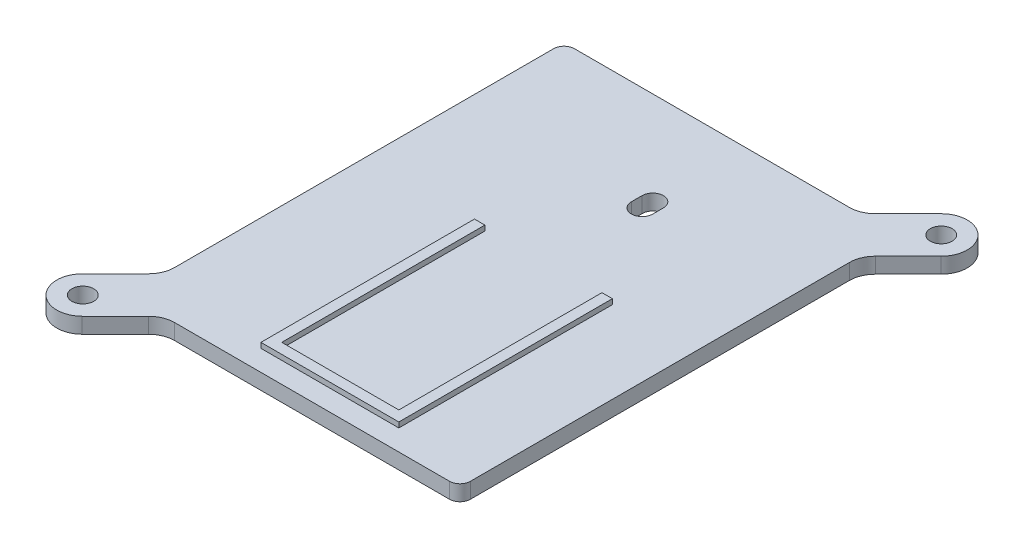
ISO-10303-21;
HEADER;
FILE_DESCRIPTION(('STEP AP214'),'2;1');
FILE_NAME('part.step','',(''),(''),'','','');
FILE_SCHEMA(('AUTOMOTIVE_DESIGN { 1 0 10303 214 1 1 1 1 }'));
ENDSEC;
DATA;
#1=APPLICATION_CONTEXT('core data for automotive mechanical design processes');
#2=APPLICATION_PROTOCOL_DEFINITION('international standard','automotive_design',2000,#1);
#3=PRODUCT_CONTEXT('',#1,'mechanical');
#4=PRODUCT('Part','Part','',(#3));
#5=PRODUCT_RELATED_PRODUCT_CATEGORY('part','',(#4));
#6=PRODUCT_DEFINITION_FORMATION('','',#4);
#7=PRODUCT_DEFINITION_CONTEXT('part definition',#1,'design');
#8=PRODUCT_DEFINITION('design','',#6,#7);
#9=PRODUCT_DEFINITION_SHAPE('','',#8);
#10=(LENGTH_UNIT() NAMED_UNIT(*) SI_UNIT(.MILLI.,.METRE.));
#11=(NAMED_UNIT(*) PLANE_ANGLE_UNIT() SI_UNIT($,.RADIAN.));
#12=(NAMED_UNIT(*) SI_UNIT($,.STERADIAN.) SOLID_ANGLE_UNIT());
#13=UNCERTAINTY_MEASURE_WITH_UNIT(LENGTH_MEASURE(1.E-05),#10,'distance_accuracy_value','');
#14=(GEOMETRIC_REPRESENTATION_CONTEXT(3) GLOBAL_UNCERTAINTY_ASSIGNED_CONTEXT((#13)) GLOBAL_UNIT_ASSIGNED_CONTEXT((#10,
#11,#12)) REPRESENTATION_CONTEXT('',''));
#15=CARTESIAN_POINT('',(0.,0.,0.));
#16=DIRECTION('',(0.,0.,1.));
#17=DIRECTION('',(1.,0.,0.));
#18=AXIS2_PLACEMENT_3D('',#15,#16,#17);
#19=CARTESIAN_POINT('',(45.5351143657771,0.,45.5351143657769));
#20=DIRECTION('',(0.707106781186549,0.,0.707106781186546));
#21=DIRECTION('',(0.707106781186546,0.,-0.707106781186549));
#22=AXIS2_PLACEMENT_3D('',#19,#20,#21);
#23=PLANE('',#22);
#24=DIRECTION('',(0.707106781186546,0.,-0.707106781186549));
#25=VECTOR('',#24,1.);
#26=CARTESIAN_POINT('',(45.5351143657771,0.,45.5351143657769));
#27=LINE('',#26,#25);
#28=CARTESIAN_POINT('',(-0.761991180438154,0.,91.8322199119924));
#29=VERTEX_POINT('',#28);
#30=CARTESIAN_POINT('',(5.60576263748689,0.,85.4644660940673));
#31=VERTEX_POINT('',#30);
#32=EDGE_CURVE('E370',#29,#31,#27,.T.);
#33=ORIENTED_EDGE('',*,*,#32,.T.);
#34=DIRECTION('',(0.,1.,0.));
#35=VECTOR('',#34,1.);
#36=CARTESIAN_POINT('',(5.60576263748688,0.,85.4644660940673));
#37=LINE('',#36,#35);
#38=CARTESIAN_POINT('',(5.60576263748689,3.,85.4644660940673));
#39=VERTEX_POINT('',#38);
#40=EDGE_CURVE('E412',#31,#39,#37,.T.);
#41=ORIENTED_EDGE('',*,*,#40,.T.);
#42=DIRECTION('',(0.707106781186546,0.,-0.707106781186549));
#43=VECTOR('',#42,1.);
#44=CARTESIAN_POINT('',(45.5351143657771,3.,45.5351143657769));
#45=LINE('',#44,#43);
#46=CARTESIAN_POINT('',(-0.761991180438154,3.,91.8322199119924));
#47=VERTEX_POINT('',#46);
#48=EDGE_CURVE('E361',#47,#39,#45,.T.);
#49=ORIENTED_EDGE('',*,*,#48,.F.);
#50=DIRECTION('',(0.,1.,0.));
#51=VECTOR('',#50,1.);
#52=CARTESIAN_POINT('',(-0.761991180438154,0.,91.8322199119924));
#53=LINE('',#52,#51);
#54=EDGE_CURVE('E394',#29,#47,#53,.T.);
#55=ORIENTED_EDGE('',*,*,#54,.F.);
#56=EDGE_LOOP('',(#33,#41,#49,#55));
#57=FACE_BOUND('',#56,.T.);
#58=ADVANCED_FACE('F45',(#57),#23,.T.);
#59=CARTESIAN_POINT('',(-4.24264068711929,0.,88.2426406871193));
#60=DIRECTION('',(0.,1.,0.));
#61=DIRECTION('',(0.,0.,1.));
#62=AXIS2_PLACEMENT_3D('',#59,#60,#61);
#63=CYLINDRICAL_SURFACE('',#62,5.);
#64=CARTESIAN_POINT('',(-4.24264068711929,3.,88.2426406871193));
#65=DIRECTION('',(0.,1.,0.));
#66=DIRECTION('',(0.,0.,1.));
#67=AXIS2_PLACEMENT_3D('',#64,#65,#66);
#68=CIRCLE('',#67,5.);
#69=CARTESIAN_POINT('',(-7.77817459305204,3.,84.7071067811866));
#70=VERTEX_POINT('',#69);
#71=EDGE_CURVE('E389',#70,#47,#68,.T.);
#72=ORIENTED_EDGE('',*,*,#71,.F.);
#73=DIRECTION('',(0.,1.,0.));
#74=VECTOR('',#73,1.);
#75=CARTESIAN_POINT('',(-7.77817459305204,0.,84.7071067811866));
#76=LINE('',#75,#74);
#77=CARTESIAN_POINT('',(-7.77817459305204,0.,84.7071067811866));
#78=VERTEX_POINT('',#77);
#79=EDGE_CURVE('E383',#78,#70,#76,.T.);
#80=ORIENTED_EDGE('',*,*,#79,.F.);
#81=CARTESIAN_POINT('',(-4.24264068711929,0.,88.2426406871193));
#82=DIRECTION('',(0.,1.,0.));
#83=DIRECTION('',(0.,0.,1.));
#84=AXIS2_PLACEMENT_3D('',#81,#82,#83);
#85=CIRCLE('',#84,5.);
#86=EDGE_CURVE('E377',#78,#29,#85,.T.);
#87=ORIENTED_EDGE('',*,*,#86,.T.);
#88=ORIENTED_EDGE('',*,*,#54,.T.);
#89=EDGE_LOOP('',(#72,#80,#87,#88));
#90=FACE_BOUND('',#89,.T.);
#91=ADVANCED_FACE('F511',(#90),#63,.T.);
#92=CARTESIAN_POINT('',(38.4644660940672,0.,38.4644660940669));
#93=DIRECTION('',(0.70710678118655,0.,0.707106781186545));
#94=DIRECTION('',(0.707106781186545,0.,-0.70710678118655));
#95=AXIS2_PLACEMENT_3D('',#92,#93,#94);
#96=PLANE('',#95);
#97=DIRECTION('',(0.707106781186545,0.,-0.70710678118655));
#98=VECTOR('',#97,1.);
#99=CARTESIAN_POINT('',(38.4644660940672,3.,38.4644660940669));
#100=LINE('',#99,#98);
#101=CARTESIAN_POINT('',(-1.46446609406726,3.,78.3933982822017));
#102=VERTEX_POINT('',#101);
#103=EDGE_CURVE('E386',#70,#102,#100,.T.);
#104=ORIENTED_EDGE('',*,*,#103,.T.);
#105=DIRECTION('',(0.,1.,0.));
#106=VECTOR('',#105,1.);
#107=CARTESIAN_POINT('',(-1.46446609406725,0.,78.3933982822017));
#108=LINE('',#107,#106);
#109=CARTESIAN_POINT('',(-1.46446609406726,0.,78.3933982822017));
#110=VERTEX_POINT('',#109);
#111=EDGE_CURVE('E410',#102,#110,#108,.F.);
#112=ORIENTED_EDGE('',*,*,#111,.T.);
#113=DIRECTION('',(0.707106781186545,0.,-0.70710678118655));
#114=VECTOR('',#113,1.);
#115=CARTESIAN_POINT('',(38.4644660940672,0.,38.4644660940669));
#116=LINE('',#115,#114);
#117=EDGE_CURVE('E373',#78,#110,#116,.T.);
#118=ORIENTED_EDGE('',*,*,#117,.F.);
#119=ORIENTED_EDGE('',*,*,#79,.T.);
#120=EDGE_LOOP('',(#104,#112,#118,#119));
#121=FACE_BOUND('',#120,.T.);
#122=ADVANCED_FACE('F506',(#121),#96,.F.);
#123=CARTESIAN_POINT('',(-4.24264068711929,0.,88.2426406871193));
#124=DIRECTION('',(0.,1.,0.));
#125=DIRECTION('',(0.,0.,1.));
#126=AXIS2_PLACEMENT_3D('',#123,#124,#125);
#127=CYLINDRICAL_SURFACE('',#126,2.1);
#128=CARTESIAN_POINT('',(-4.24264068711929,0.,88.2426406871193));
#129=DIRECTION('',(0.,1.,0.));
#130=DIRECTION('',(0.,0.,1.));
#131=AXIS2_PLACEMENT_3D('',#128,#129,#130);
#132=CIRCLE('',#131,2.1);
#133=CARTESIAN_POINT('',(-4.24264068711929,0.,90.3426406871193));
#134=VERTEX_POINT('',#133);
#135=EDGE_CURVE('E380',#134,#134,#132,.T.);
#136=ORIENTED_EDGE('',*,*,#135,.F.);
#137=EDGE_LOOP('',(#136));
#138=FACE_BOUND('',#137,.T.);
#139=CARTESIAN_POINT('',(-4.24264068711929,3.,88.2426406871193));
#140=DIRECTION('',(0.,1.,0.));
#141=DIRECTION('',(0.,0.,1.));
#142=AXIS2_PLACEMENT_3D('',#139,#140,#141);
#143=CIRCLE('',#142,2.1);
#144=CARTESIAN_POINT('',(-4.24264068711929,3.,90.3426406871193));
#145=VERTEX_POINT('',#144);
#146=EDGE_CURVE('E374',#145,#145,#143,.T.);
#147=ORIENTED_EDGE('',*,*,#146,.T.);
#148=EDGE_LOOP('',(#147));
#149=FACE_BOUND('',#148,.T.);
#150=ADVANCED_FACE('F667',(#138,#149),#127,.F.);
#151=CARTESIAN_POINT('',(0.,0.,0.));
#152=DIRECTION('',(0.,1.,0.));
#153=DIRECTION('',(0.,0.,1.));
#154=AXIS2_PLACEMENT_3D('',#151,#152,#153);
#155=PLANE('',#154);
#156=DIRECTION('',(0.,0.,-1.));
#157=VECTOR('',#156,1.);
#158=CARTESIAN_POINT('',(37.0499999999999,0.,-1.25407814214518E-13));
#159=LINE('',#158,#157);
#160=CARTESIAN_POINT('',(37.05,0.,19.9999999999994));
#161=VERTEX_POINT('',#160);
#162=CARTESIAN_POINT('',(37.05,0.,17.9499999999994));
#163=VERTEX_POINT('',#162);
#164=EDGE_CURVE('E260',#161,#163,#159,.T.);
#165=ORIENTED_EDGE('',*,*,#164,.T.);
#166=CARTESIAN_POINT('',(35.,0.,17.9499999999994));
#167=DIRECTION('',(0.,1.,0.));
#168=DIRECTION('',(0.,0.,1.));
#169=AXIS2_PLACEMENT_3D('',#166,#167,#168);
#170=CIRCLE('',#169,2.04999999999999);
#171=CARTESIAN_POINT('',(32.95,0.,17.9499999999994));
#172=VERTEX_POINT('',#171);
#173=EDGE_CURVE('E263',#163,#172,#170,.T.);
#174=ORIENTED_EDGE('',*,*,#173,.T.);
#175=DIRECTION('',(0.,0.,1.));
#176=VECTOR('',#175,1.);
#177=CARTESIAN_POINT('',(32.95,0.,0.));
#178=LINE('',#177,#176);
#179=CARTESIAN_POINT('',(32.95,0.,19.9999999999994));
#180=VERTEX_POINT('',#179);
#181=EDGE_CURVE('E255',#172,#180,#178,.T.);
#182=ORIENTED_EDGE('',*,*,#181,.T.);
#183=CARTESIAN_POINT('',(35.,0.,19.9999999999994));
#184=DIRECTION('',(0.,1.,0.));
#185=DIRECTION('',(0.,0.,1.));
#186=AXIS2_PLACEMENT_3D('',#183,#184,#185);
#187=CIRCLE('',#186,2.05);
#188=EDGE_CURVE('E235',#180,#161,#187,.T.);
#189=ORIENTED_EDGE('',*,*,#188,.T.);
#190=EDGE_LOOP('',(#165,#174,#182,#189));
#191=FACE_BOUND('',#190,.T.);
#192=DIRECTION('',(0.,0.,1.));
#193=VECTOR('',#192,1.);
#194=CARTESIAN_POINT('',(0.,0.,0.));
#195=LINE('',#194,#193);
#196=CARTESIAN_POINT('',(0.,0.,2.));
#197=VERTEX_POINT('',#196);
#198=CARTESIAN_POINT('',(0.,0.,74.857864376269));
#199=VERTEX_POINT('',#198);
#200=EDGE_CURVE('E364',#197,#199,#195,.T.);
#201=ORIENTED_EDGE('',*,*,#200,.F.);
#202=CARTESIAN_POINT('',(2.,0.,2.));
#203=DIRECTION('',(0.,1.,0.));
#204=DIRECTION('',(0.,0.,1.));
#205=AXIS2_PLACEMENT_3D('',#202,#203,#204);
#206=CIRCLE('',#205,2.);
#207=CARTESIAN_POINT('',(2.,0.,0.));
#208=VERTEX_POINT('',#207);
#209=EDGE_CURVE('E440',#197,#208,#206,.F.);
#210=ORIENTED_EDGE('',*,*,#209,.T.);
#211=DIRECTION('',(-1.,0.,0.));
#212=VECTOR('',#211,1.);
#213=CARTESIAN_POINT('',(64.,0.,0.));
#214=LINE('',#213,#212);
#215=CARTESIAN_POINT('',(54.8578643762687,0.,0.));
#216=VERTEX_POINT('',#215);
#217=EDGE_CURVE('E349',#216,#208,#214,.T.);
#218=ORIENTED_EDGE('',*,*,#217,.F.);
#219=CARTESIAN_POINT('',(54.8578643762687,0.,-4.99999999999999));
#220=DIRECTION('',(0.,1.,0.));
#221=DIRECTION('',(0.,0.,1.));
#222=AXIS2_PLACEMENT_3D('',#219,#220,#221);
#223=CIRCLE('',#222,5.);
#224=CARTESIAN_POINT('',(58.3933982822015,0.,-1.46446609406729));
#225=VERTEX_POINT('',#224);
#226=EDGE_CURVE('E424',#216,#225,#223,.T.);
#227=ORIENTED_EDGE('',*,*,#226,.T.);
#228=DIRECTION('',(0.707106781186541,0.,-0.707106781186554));
#229=VECTOR('',#228,1.);
#230=CARTESIAN_POINT('',(28.4644660940676,0.,28.4644660940671));
#231=LINE('',#230,#229);
#232=CARTESIAN_POINT('',(64.7071067811863,0.,-7.77817459305219));
#233=VERTEX_POINT('',#232);
#234=EDGE_CURVE('E274',#225,#233,#231,.T.);
#235=ORIENTED_EDGE('',*,*,#234,.T.);
#236=CARTESIAN_POINT('',(68.2426406871191,0.,-4.24264068711948));
#237=DIRECTION('',(0.,1.,0.));
#238=DIRECTION('',(0.,0.,1.));
#239=AXIS2_PLACEMENT_3D('',#236,#237,#238);
#240=CIRCLE('',#239,5.00000000000014);
#241=CARTESIAN_POINT('',(71.7781745930524,0.,-0.707106781186066));
#242=VERTEX_POINT('',#241);
#243=EDGE_CURVE('E270',#242,#233,#240,.T.);
#244=ORIENTED_EDGE('',*,*,#243,.F.);
#245=DIRECTION('',(-0.707106781186561,0.,0.707106781186535));
#246=VECTOR('',#245,1.);
#247=CARTESIAN_POINT('',(35.5355339059318,0.,35.5355339059331));
#248=LINE('',#247,#246);
#249=CARTESIAN_POINT('',(65.4644660940673,0.,5.60660171779873));
#250=VERTEX_POINT('',#249);
#251=EDGE_CURVE('E267',#242,#250,#248,.T.);
#252=ORIENTED_EDGE('',*,*,#251,.T.);
#253=CARTESIAN_POINT('',(69.,0.,9.14213562373153));
#254=DIRECTION('',(0.,1.,0.));
#255=DIRECTION('',(0.,0.,1.));
#256=AXIS2_PLACEMENT_3D('',#253,#254,#255);
#257=CIRCLE('',#256,5.);
#258=CARTESIAN_POINT('',(64.,0.,9.14213562373153));
#259=VERTEX_POINT('',#258);
#260=EDGE_CURVE('E419',#250,#259,#257,.T.);
#261=ORIENTED_EDGE('',*,*,#260,.T.);
#262=DIRECTION('',(0.,0.,-1.));
#263=VECTOR('',#262,1.);
#264=CARTESIAN_POINT('',(64.,0.,84.));
#265=LINE('',#264,#263);
#266=CARTESIAN_POINT('',(64.,0.,82.));
#267=VERTEX_POINT('',#266);
#268=EDGE_CURVE('E354',#267,#259,#265,.T.);
#269=ORIENTED_EDGE('',*,*,#268,.F.);
#270=CARTESIAN_POINT('',(62.,0.,82.));
#271=DIRECTION('',(0.,1.,0.));
#272=DIRECTION('',(0.,0.,1.));
#273=AXIS2_PLACEMENT_3D('',#270,#271,#272);
#274=CIRCLE('',#273,2.);
#275=CARTESIAN_POINT('',(62.,0.,84.));
#276=VERTEX_POINT('',#275);
#277=EDGE_CURVE('E438',#267,#276,#274,.F.);
#278=ORIENTED_EDGE('',*,*,#277,.T.);
#279=DIRECTION('',(1.,0.,0.));
#280=VECTOR('',#279,1.);
#281=CARTESIAN_POINT('',(0.,0.,84.));
#282=LINE('',#281,#280);
#283=CARTESIAN_POINT('',(9.14129654341964,0.,84.));
#284=VERTEX_POINT('',#283);
#285=EDGE_CURVE('E366',#284,#276,#282,.T.);
#286=ORIENTED_EDGE('',*,*,#285,.F.);
#287=CARTESIAN_POINT('',(9.14129654341964,0.,89.));
#288=DIRECTION('',(0.,1.,0.));
#289=DIRECTION('',(0.,0.,1.));
#290=AXIS2_PLACEMENT_3D('',#287,#288,#289);
#291=CIRCLE('',#290,5.);
#292=EDGE_CURVE('E433',#284,#31,#291,.T.);
#293=ORIENTED_EDGE('',*,*,#292,.T.);
#294=ORIENTED_EDGE('',*,*,#32,.F.);
#295=ORIENTED_EDGE('',*,*,#86,.F.);
#296=ORIENTED_EDGE('',*,*,#117,.T.);
#297=CARTESIAN_POINT('',(-5.,0.,74.857864376269));
#298=DIRECTION('',(0.,1.,0.));
#299=DIRECTION('',(0.,0.,1.));
#300=AXIS2_PLACEMENT_3D('',#297,#298,#299);
#301=CIRCLE('',#300,5.);
#302=EDGE_CURVE('E428',#110,#199,#301,.T.);
#303=ORIENTED_EDGE('',*,*,#302,.T.);
#304=EDGE_LOOP('',(#201,#210,#218,#227,#235,#244,#252,#261,#269,#278,#286,#293,#294,#295,#296,#303));
#305=FACE_BOUND('',#304,.T.);
#306=ORIENTED_EDGE('',*,*,#135,.T.);
#307=EDGE_LOOP('',(#306));
#308=FACE_BOUND('',#307,.T.);
#309=CARTESIAN_POINT('',(68.2426406871191,0.,-4.24264068711948));
#310=DIRECTION('',(0.,1.,0.));
#311=DIRECTION('',(0.,0.,1.));
#312=AXIS2_PLACEMENT_3D('',#309,#310,#311);
#313=CIRCLE('',#312,2.10000000000014);
#314=CARTESIAN_POINT('',(68.2426406871191,0.,-2.14264068711934));
#315=VERTEX_POINT('',#314);
#316=EDGE_CURVE('E276',#315,#315,#313,.T.);
#317=ORIENTED_EDGE('',*,*,#316,.T.);
#318=EDGE_LOOP('',(#317));
#319=FACE_BOUND('',#318,.T.);
#320=ADVANCED_FACE('F457',(#191,#305,#308,#319),#155,.F.);
#321=CARTESIAN_POINT('',(0.,3.,0.));
#322=DIRECTION('',(0.,1.,0.));
#323=DIRECTION('',(0.,0.,1.));
#324=AXIS2_PLACEMENT_3D('',#321,#322,#323);
#325=PLANE('',#324);
#326=CARTESIAN_POINT('',(35.,3.,17.9499999999994));
#327=DIRECTION('',(0.,1.,0.));
#328=DIRECTION('',(0.,0.,-1.));
#329=AXIS2_PLACEMENT_3D('',#326,#327,#328);
#330=CIRCLE('',#329,2.04999999999999);
#331=CARTESIAN_POINT('',(37.05,3.,17.9499999999994));
#332=VERTEX_POINT('',#331);
#333=CARTESIAN_POINT('',(32.95,3.,17.9499999999994));
#334=VERTEX_POINT('',#333);
#335=EDGE_CURVE('E68',#332,#334,#330,.T.);
#336=ORIENTED_EDGE('',*,*,#335,.F.);
#337=DIRECTION('',(0.,0.,-1.));
#338=VECTOR('',#337,1.);
#339=CARTESIAN_POINT('',(37.05,3.,17.9499999999994));
#340=LINE('',#339,#338);
#341=CARTESIAN_POINT('',(37.05,3.,19.9999999999994));
#342=VERTEX_POINT('',#341);
#343=EDGE_CURVE('E248',#342,#332,#340,.T.);
#344=ORIENTED_EDGE('',*,*,#343,.F.);
#345=CARTESIAN_POINT('',(35.,3.,19.9999999999994));
#346=DIRECTION('',(0.,1.,0.));
#347=DIRECTION('',(0.,0.,1.));
#348=AXIS2_PLACEMENT_3D('',#345,#346,#347);
#349=CIRCLE('',#348,2.05);
#350=CARTESIAN_POINT('',(32.95,3.,19.9999999999994));
#351=VERTEX_POINT('',#350);
#352=EDGE_CURVE('E232',#351,#342,#349,.T.);
#353=ORIENTED_EDGE('',*,*,#352,.F.);
#354=DIRECTION('',(0.,0.,1.));
#355=VECTOR('',#354,1.);
#356=CARTESIAN_POINT('',(32.95,3.,17.9499999999994));
#357=LINE('',#356,#355);
#358=EDGE_CURVE('E241',#334,#351,#357,.T.);
#359=ORIENTED_EDGE('',*,*,#358,.F.);
#360=EDGE_LOOP('',(#336,#344,#353,#359));
#361=FACE_BOUND('',#360,.T.);
#362=DIRECTION('',(-1.,0.,0.));
#363=VECTOR('',#362,1.);
#364=CARTESIAN_POINT('',(64.,3.,0.));
#365=LINE('',#364,#363);
#366=CARTESIAN_POINT('',(54.8578643762687,3.,0.));
#367=VERTEX_POINT('',#366);
#368=CARTESIAN_POINT('',(2.,3.,0.));
#369=VERTEX_POINT('',#368);
#370=EDGE_CURVE('E350',#367,#369,#365,.T.);
#371=ORIENTED_EDGE('',*,*,#370,.T.);
#372=CARTESIAN_POINT('',(2.,3.,2.));
#373=DIRECTION('',(0.,1.,0.));
#374=DIRECTION('',(0.,0.,1.));
#375=AXIS2_PLACEMENT_3D('',#372,#373,#374);
#376=CIRCLE('',#375,2.);
#377=CARTESIAN_POINT('',(0.,3.,2.));
#378=VERTEX_POINT('',#377);
#379=EDGE_CURVE('E446',#369,#378,#376,.T.);
#380=ORIENTED_EDGE('',*,*,#379,.T.);
#381=DIRECTION('',(0.,0.,1.));
#382=VECTOR('',#381,1.);
#383=CARTESIAN_POINT('',(0.,3.,0.));
#384=LINE('',#383,#382);
#385=CARTESIAN_POINT('',(0.,3.,74.857864376269));
#386=VERTEX_POINT('',#385);
#387=EDGE_CURVE('E353',#378,#386,#384,.T.);
#388=ORIENTED_EDGE('',*,*,#387,.T.);
#389=CARTESIAN_POINT('',(-5.,3.,74.857864376269));
#390=DIRECTION('',(0.,1.,0.));
#391=DIRECTION('',(0.,0.,1.));
#392=AXIS2_PLACEMENT_3D('',#389,#390,#391);
#393=CIRCLE('',#392,5.);
#394=EDGE_CURVE('E426',#386,#102,#393,.F.);
#395=ORIENTED_EDGE('',*,*,#394,.T.);
#396=ORIENTED_EDGE('',*,*,#103,.F.);
#397=ORIENTED_EDGE('',*,*,#71,.T.);
#398=ORIENTED_EDGE('',*,*,#48,.T.);
#399=CARTESIAN_POINT('',(9.14129654341964,3.,89.));
#400=DIRECTION('',(0.,1.,0.));
#401=DIRECTION('',(0.,0.,1.));
#402=AXIS2_PLACEMENT_3D('',#399,#400,#401);
#403=CIRCLE('',#402,5.);
#404=CARTESIAN_POINT('',(9.14129654341964,3.,84.));
#405=VERTEX_POINT('',#404);
#406=EDGE_CURVE('E431',#39,#405,#403,.F.);
#407=ORIENTED_EDGE('',*,*,#406,.T.);
#408=DIRECTION('',(1.,0.,0.));
#409=VECTOR('',#408,1.);
#410=CARTESIAN_POINT('',(0.,3.,84.));
#411=LINE('',#410,#409);
#412=CARTESIAN_POINT('',(62.,3.,84.));
#413=VERTEX_POINT('',#412);
#414=EDGE_CURVE('E356',#405,#413,#411,.T.);
#415=ORIENTED_EDGE('',*,*,#414,.T.);
#416=CARTESIAN_POINT('',(62.,3.,82.));
#417=DIRECTION('',(0.,1.,0.));
#418=DIRECTION('',(0.,0.,1.));
#419=AXIS2_PLACEMENT_3D('',#416,#417,#418);
#420=CIRCLE('',#419,2.);
#421=CARTESIAN_POINT('',(64.,3.,82.));
#422=VERTEX_POINT('',#421);
#423=EDGE_CURVE('E444',#413,#422,#420,.T.);
#424=ORIENTED_EDGE('',*,*,#423,.T.);
#425=DIRECTION('',(0.,0.,-1.));
#426=VECTOR('',#425,1.);
#427=CARTESIAN_POINT('',(64.,3.,84.));
#428=LINE('',#427,#426);
#429=CARTESIAN_POINT('',(64.,3.,9.14213562373153));
#430=VERTEX_POINT('',#429);
#431=EDGE_CURVE('E359',#422,#430,#428,.T.);
#432=ORIENTED_EDGE('',*,*,#431,.T.);
#433=CARTESIAN_POINT('',(69.,3.,9.14213562373153));
#434=DIRECTION('',(0.,1.,0.));
#435=DIRECTION('',(0.,0.,1.));
#436=AXIS2_PLACEMENT_3D('',#433,#434,#435);
#437=CIRCLE('',#436,5.);
#438=CARTESIAN_POINT('',(65.4644660940673,3.,5.60660171779873));
#439=VERTEX_POINT('',#438);
#440=EDGE_CURVE('E417',#430,#439,#437,.F.);
#441=ORIENTED_EDGE('',*,*,#440,.T.);
#442=DIRECTION('',(-0.707106781186561,0.,0.707106781186535));
#443=VECTOR('',#442,1.);
#444=CARTESIAN_POINT('',(35.5355339059318,3.,35.5355339059331));
#445=LINE('',#444,#443);
#446=CARTESIAN_POINT('',(71.7781745930524,3.,-0.707106781186066));
#447=VERTEX_POINT('',#446);
#448=EDGE_CURVE('E266',#447,#439,#445,.T.);
#449=ORIENTED_EDGE('',*,*,#448,.F.);
#450=CARTESIAN_POINT('',(68.2426406871191,3.,-4.24264068711948));
#451=DIRECTION('',(0.,1.,0.));
#452=DIRECTION('',(0.,0.,1.));
#453=AXIS2_PLACEMENT_3D('',#450,#451,#452);
#454=CIRCLE('',#453,5.00000000000014);
#455=CARTESIAN_POINT('',(64.7071067811863,3.,-7.77817459305219));
#456=VERTEX_POINT('',#455);
#457=EDGE_CURVE('E282',#447,#456,#454,.T.);
#458=ORIENTED_EDGE('',*,*,#457,.T.);
#459=DIRECTION('',(0.707106781186541,0.,-0.707106781186554));
#460=VECTOR('',#459,1.);
#461=CARTESIAN_POINT('',(28.4644660940676,3.,28.4644660940671));
#462=LINE('',#461,#460);
#463=CARTESIAN_POINT('',(58.3933982822015,3.,-1.46446609406729));
#464=VERTEX_POINT('',#463);
#465=EDGE_CURVE('E285',#464,#456,#462,.T.);
#466=ORIENTED_EDGE('',*,*,#465,.F.);
#467=CARTESIAN_POINT('',(54.8578643762687,3.,-4.99999999999999));
#468=DIRECTION('',(0.,1.,0.));
#469=DIRECTION('',(0.,0.,1.));
#470=AXIS2_PLACEMENT_3D('',#467,#468,#469);
#471=CIRCLE('',#470,5.);
#472=EDGE_CURVE('E422',#464,#367,#471,.F.);
#473=ORIENTED_EDGE('',*,*,#472,.T.);
#474=EDGE_LOOP('',(#371,#380,#388,#395,#396,#397,#398,#407,#415,#424,#432,#441,#449,#458,#466,#473));
#475=FACE_BOUND('',#474,.T.);
#476=ORIENTED_EDGE('',*,*,#146,.F.);
#477=EDGE_LOOP('',(#476));
#478=FACE_BOUND('',#477,.T.);
#479=CARTESIAN_POINT('',(68.2426406871191,3.,-4.24264068711948));
#480=DIRECTION('',(0.,1.,0.));
#481=DIRECTION('',(0.,0.,1.));
#482=AXIS2_PLACEMENT_3D('',#479,#480,#481);
#483=CIRCLE('',#482,2.10000000000014);
#484=CARTESIAN_POINT('',(68.2426406871191,3.,-2.14264068711934));
#485=VERTEX_POINT('',#484);
#486=EDGE_CURVE('E271',#485,#485,#483,.T.);
#487=ORIENTED_EDGE('',*,*,#486,.F.);
#488=EDGE_LOOP('',(#487));
#489=FACE_BOUND('',#488,.T.);
#490=DIRECTION('',(-1.,0.,0.));
#491=VECTOR('',#490,1.);
#492=CARTESIAN_POINT('',(23.75,3.,78.));
#493=LINE('',#492,#491);
#494=CARTESIAN_POINT('',(46.25,3.,78.));
#495=VERTEX_POINT('',#494);
#496=CARTESIAN_POINT('',(23.75,3.,78.));
#497=VERTEX_POINT('',#496);
#498=EDGE_CURVE('E313',#495,#497,#493,.T.);
#499=ORIENTED_EDGE('',*,*,#498,.F.);
#500=DIRECTION('',(0.,0.,1.));
#501=VECTOR('',#500,1.);
#502=CARTESIAN_POINT('',(46.25,3.,68.9611755776803));
#503=LINE('',#502,#501);
#504=CARTESIAN_POINT('',(46.25,3.,38.9611755776803));
#505=VERTEX_POINT('',#504);
#506=EDGE_CURVE('E292',#505,#495,#503,.T.);
#507=ORIENTED_EDGE('',*,*,#506,.F.);
#508=DIRECTION('',(-1.,0.,0.));
#509=VECTOR('',#508,1.);
#510=CARTESIAN_POINT('',(46.25,3.,38.9611755776803));
#511=LINE('',#510,#509);
#512=CARTESIAN_POINT('',(48.25,3.,38.9611755776803));
#513=VERTEX_POINT('',#512);
#514=EDGE_CURVE('E297',#513,#505,#511,.T.);
#515=ORIENTED_EDGE('',*,*,#514,.F.);
#516=DIRECTION('',(0.,0.,-1.));
#517=VECTOR('',#516,1.);
#518=CARTESIAN_POINT('',(48.25,3.,38.9611755776803));
#519=LINE('',#518,#517);
#520=CARTESIAN_POINT('',(48.25,3.,80.));
#521=VERTEX_POINT('',#520);
#522=EDGE_CURVE('E323',#521,#513,#519,.T.);
#523=ORIENTED_EDGE('',*,*,#522,.F.);
#524=DIRECTION('',(1.,0.,0.));
#525=VECTOR('',#524,1.);
#526=CARTESIAN_POINT('',(21.75,3.,80.));
#527=LINE('',#526,#525);
#528=CARTESIAN_POINT('',(21.75,3.,80.));
#529=VERTEX_POINT('',#528);
#530=EDGE_CURVE('E321',#529,#521,#527,.T.);
#531=ORIENTED_EDGE('',*,*,#530,.F.);
#532=DIRECTION('',(0.,0.,1.));
#533=VECTOR('',#532,1.);
#534=CARTESIAN_POINT('',(21.75,3.,38.9611755776803));
#535=LINE('',#534,#533);
#536=CARTESIAN_POINT('',(21.75,3.,38.9611755776803));
#537=VERTEX_POINT('',#536);
#538=EDGE_CURVE('E319',#537,#529,#535,.T.);
#539=ORIENTED_EDGE('',*,*,#538,.F.);
#540=DIRECTION('',(-1.,0.,0.));
#541=VECTOR('',#540,1.);
#542=CARTESIAN_POINT('',(23.75,3.,38.9611755776803));
#543=LINE('',#542,#541);
#544=CARTESIAN_POINT('',(23.75,3.,38.9611755776803));
#545=VERTEX_POINT('',#544);
#546=EDGE_CURVE('E317',#545,#537,#543,.T.);
#547=ORIENTED_EDGE('',*,*,#546,.F.);
#548=DIRECTION('',(0.,0.,-1.));
#549=VECTOR('',#548,1.);
#550=CARTESIAN_POINT('',(23.75,3.,68.9611755776803));
#551=LINE('',#550,#549);
#552=EDGE_CURVE('E315',#497,#545,#551,.T.);
#553=ORIENTED_EDGE('',*,*,#552,.F.);
#554=EDGE_LOOP('',(#499,#507,#515,#523,#531,#539,#547,#553));
#555=FACE_BOUND('',#554,.T.);
#556=ADVANCED_FACE('F245',(#361,#475,#478,#489,#555),#325,.T.);
#557=CARTESIAN_POINT('',(64.,3.,0.));
#558=DIRECTION('',(0.,0.,1.));
#559=DIRECTION('',(1.,0.,0.));
#560=AXIS2_PLACEMENT_3D('',#557,#558,#559);
#561=PLANE('',#560);
#562=ORIENTED_EDGE('',*,*,#217,.T.);
#563=DIRECTION('',(0.,-1.,0.));
#564=VECTOR('',#563,1.);
#565=CARTESIAN_POINT('',(2.,3.,0.));
#566=LINE('',#565,#564);
#567=EDGE_CURVE('E442',#208,#369,#566,.F.);
#568=ORIENTED_EDGE('',*,*,#567,.T.);
#569=ORIENTED_EDGE('',*,*,#370,.F.);
#570=DIRECTION('',(0.,1.,0.));
#571=VECTOR('',#570,1.);
#572=CARTESIAN_POINT('',(54.8578643762687,0.,0.));
#573=LINE('',#572,#571);
#574=EDGE_CURVE('E405',#367,#216,#573,.F.);
#575=ORIENTED_EDGE('',*,*,#574,.T.);
#576=EDGE_LOOP('',(#562,#568,#569,#575));
#577=FACE_BOUND('',#576,.T.);
#578=ADVANCED_FACE('F488',(#577),#561,.F.);
#579=CARTESIAN_POINT('',(64.,3.,84.));
#580=DIRECTION('',(-1.,0.,0.));
#581=DIRECTION('',(0.,0.,1.));
#582=AXIS2_PLACEMENT_3D('',#579,#580,#581);
#583=PLANE('',#582);
#584=ORIENTED_EDGE('',*,*,#431,.F.);
#585=DIRECTION('',(0.,-1.,0.));
#586=VECTOR('',#585,1.);
#587=CARTESIAN_POINT('',(64.,3.,82.));
#588=LINE('',#587,#586);
#589=EDGE_CURVE('E53',#422,#267,#588,.T.);
#590=ORIENTED_EDGE('',*,*,#589,.T.);
#591=ORIENTED_EDGE('',*,*,#268,.T.);
#592=DIRECTION('',(0.,1.,0.));
#593=VECTOR('',#592,1.);
#594=CARTESIAN_POINT('',(64.,3.,9.14213562373153));
#595=LINE('',#594,#593);
#596=EDGE_CURVE('E396',#259,#430,#595,.T.);
#597=ORIENTED_EDGE('',*,*,#596,.T.);
#598=EDGE_LOOP('',(#584,#590,#591,#597));
#599=FACE_BOUND('',#598,.T.);
#600=ADVANCED_FACE('F452',(#599),#583,.F.);
#601=CARTESIAN_POINT('',(0.,3.,0.));
#602=DIRECTION('',(1.,0.,0.));
#603=DIRECTION('',(0.,0.,-1.));
#604=AXIS2_PLACEMENT_3D('',#601,#602,#603);
#605=PLANE('',#604);
#606=ORIENTED_EDGE('',*,*,#387,.F.);
#607=DIRECTION('',(0.,-1.,0.));
#608=VECTOR('',#607,1.);
#609=CARTESIAN_POINT('',(0.,3.,2.));
#610=LINE('',#609,#608);
#611=EDGE_CURVE('E435',#378,#197,#610,.T.);
#612=ORIENTED_EDGE('',*,*,#611,.T.);
#613=ORIENTED_EDGE('',*,*,#200,.T.);
#614=DIRECTION('',(0.,1.,0.));
#615=VECTOR('',#614,1.);
#616=CARTESIAN_POINT('',(0.,3.,74.857864376269));
#617=LINE('',#616,#615);
#618=EDGE_CURVE('E407',#199,#386,#617,.T.);
#619=ORIENTED_EDGE('',*,*,#618,.T.);
#620=EDGE_LOOP('',(#606,#612,#613,#619));
#621=FACE_BOUND('',#620,.T.);
#622=ADVANCED_FACE('F496',(#621),#605,.F.);
#623=CARTESIAN_POINT('',(0.,3.,84.));
#624=DIRECTION('',(0.,0.,-1.));
#625=DIRECTION('',(-1.,0.,0.));
#626=AXIS2_PLACEMENT_3D('',#623,#624,#625);
#627=PLANE('',#626);
#628=ORIENTED_EDGE('',*,*,#285,.T.);
#629=DIRECTION('',(0.,-1.,0.));
#630=VECTOR('',#629,1.);
#631=CARTESIAN_POINT('',(62.,3.,84.));
#632=LINE('',#631,#630);
#633=EDGE_CURVE('E11',#276,#413,#632,.F.);
#634=ORIENTED_EDGE('',*,*,#633,.T.);
#635=ORIENTED_EDGE('',*,*,#414,.F.);
#636=DIRECTION('',(0.,1.,0.));
#637=VECTOR('',#636,1.);
#638=CARTESIAN_POINT('',(9.14129654341964,3.,84.));
#639=LINE('',#638,#637);
#640=EDGE_CURVE('E415',#405,#284,#639,.F.);
#641=ORIENTED_EDGE('',*,*,#640,.T.);
#642=EDGE_LOOP('',(#628,#634,#635,#641));
#643=FACE_BOUND('',#642,.T.);
#644=ADVANCED_FACE('F521',(#643),#627,.F.);
#645=CARTESIAN_POINT('',(46.25,4.,68.9611755776803));
#646=DIRECTION('',(1.,0.,0.));
#647=DIRECTION('',(0.,0.,-1.));
#648=AXIS2_PLACEMENT_3D('',#645,#646,#647);
#649=PLANE('',#648);
#650=ORIENTED_EDGE('',*,*,#506,.T.);
#651=DIRECTION('',(0.,-1.,0.));
#652=VECTOR('',#651,1.);
#653=CARTESIAN_POINT('',(46.25,4.,78.));
#654=LINE('',#653,#652);
#655=CARTESIAN_POINT('',(46.25,4.,78.));
#656=VERTEX_POINT('',#655);
#657=EDGE_CURVE('E346',#656,#495,#654,.T.);
#658=ORIENTED_EDGE('',*,*,#657,.F.);
#659=DIRECTION('',(0.,0.,1.));
#660=VECTOR('',#659,1.);
#661=CARTESIAN_POINT('',(46.25,4.,68.9611755776803));
#662=LINE('',#661,#660);
#663=CARTESIAN_POINT('',(46.25,4.,38.9611755776803));
#664=VERTEX_POINT('',#663);
#665=EDGE_CURVE('E294',#664,#656,#662,.T.);
#666=ORIENTED_EDGE('',*,*,#665,.F.);
#667=DIRECTION('',(0.,-1.,0.));
#668=VECTOR('',#667,1.);
#669=CARTESIAN_POINT('',(46.25,4.,38.9611755776803));
#670=LINE('',#669,#668);
#671=EDGE_CURVE('E311',#664,#505,#670,.T.);
#672=ORIENTED_EDGE('',*,*,#671,.T.);
#673=EDGE_LOOP('',(#650,#658,#666,#672));
#674=FACE_BOUND('',#673,.T.);
#675=ADVANCED_FACE('F577',(#674),#649,.F.);
#676=CARTESIAN_POINT('',(23.75,4.,78.));
#677=DIRECTION('',(0.,0.,1.));
#678=DIRECTION('',(1.,0.,0.));
#679=AXIS2_PLACEMENT_3D('',#676,#677,#678);
#680=PLANE('',#679);
#681=ORIENTED_EDGE('',*,*,#498,.T.);
#682=DIRECTION('',(0.,-1.,0.));
#683=VECTOR('',#682,1.);
#684=CARTESIAN_POINT('',(23.75,4.,78.));
#685=LINE('',#684,#683);
#686=CARTESIAN_POINT('',(23.75,4.,78.));
#687=VERTEX_POINT('',#686);
#688=EDGE_CURVE('E343',#687,#497,#685,.T.);
#689=ORIENTED_EDGE('',*,*,#688,.F.);
#690=DIRECTION('',(-1.,0.,0.));
#691=VECTOR('',#690,1.);
#692=CARTESIAN_POINT('',(23.75,4.,78.));
#693=LINE('',#692,#691);
#694=EDGE_CURVE('E296',#656,#687,#693,.T.);
#695=ORIENTED_EDGE('',*,*,#694,.F.);
#696=ORIENTED_EDGE('',*,*,#657,.T.);
#697=EDGE_LOOP('',(#681,#689,#695,#696));
#698=FACE_BOUND('',#697,.T.);
#699=ADVANCED_FACE('F659',(#698),#680,.F.);
#700=CARTESIAN_POINT('',(23.75,4.,68.9611755776803));
#701=DIRECTION('',(-1.,0.,0.));
#702=DIRECTION('',(0.,0.,1.));
#703=AXIS2_PLACEMENT_3D('',#700,#701,#702);
#704=PLANE('',#703);
#705=ORIENTED_EDGE('',*,*,#552,.T.);
#706=DIRECTION('',(0.,-1.,0.));
#707=VECTOR('',#706,1.);
#708=CARTESIAN_POINT('',(23.75,4.,38.9611755776803));
#709=LINE('',#708,#707);
#710=CARTESIAN_POINT('',(23.75,4.,38.9611755776803));
#711=VERTEX_POINT('',#710);
#712=EDGE_CURVE('E340',#711,#545,#709,.T.);
#713=ORIENTED_EDGE('',*,*,#712,.F.);
#714=DIRECTION('',(0.,0.,-1.));
#715=VECTOR('',#714,1.);
#716=CARTESIAN_POINT('',(23.75,4.,68.9611755776803));
#717=LINE('',#716,#715);
#718=EDGE_CURVE('E299',#687,#711,#717,.T.);
#719=ORIENTED_EDGE('',*,*,#718,.F.);
#720=ORIENTED_EDGE('',*,*,#688,.T.);
#721=EDGE_LOOP('',(#705,#713,#719,#720));
#722=FACE_BOUND('',#721,.T.);
#723=ADVANCED_FACE('F655',(#722),#704,.F.);
#724=CARTESIAN_POINT('',(23.75,4.,38.9611755776803));
#725=DIRECTION('',(0.,0.,1.));
#726=DIRECTION('',(1.,0.,0.));
#727=AXIS2_PLACEMENT_3D('',#724,#725,#726);
#728=PLANE('',#727);
#729=ORIENTED_EDGE('',*,*,#546,.T.);
#730=DIRECTION('',(0.,-1.,0.));
#731=VECTOR('',#730,1.);
#732=CARTESIAN_POINT('',(21.75,4.,38.9611755776803));
#733=LINE('',#732,#731);
#734=CARTESIAN_POINT('',(21.75,4.,38.9611755776803));
#735=VERTEX_POINT('',#734);
#736=EDGE_CURVE('E337',#735,#537,#733,.T.);
#737=ORIENTED_EDGE('',*,*,#736,.F.);
#738=DIRECTION('',(-1.,0.,0.));
#739=VECTOR('',#738,1.);
#740=CARTESIAN_POINT('',(23.75,4.,38.9611755776803));
#741=LINE('',#740,#739);
#742=EDGE_CURVE('E301',#711,#735,#741,.T.);
#743=ORIENTED_EDGE('',*,*,#742,.F.);
#744=ORIENTED_EDGE('',*,*,#712,.T.);
#745=EDGE_LOOP('',(#729,#737,#743,#744));
#746=FACE_BOUND('',#745,.T.);
#747=ADVANCED_FACE('F651',(#746),#728,.F.);
#748=CARTESIAN_POINT('',(21.75,4.,38.9611755776803));
#749=DIRECTION('',(1.,0.,0.));
#750=DIRECTION('',(0.,0.,-1.));
#751=AXIS2_PLACEMENT_3D('',#748,#749,#750);
#752=PLANE('',#751);
#753=ORIENTED_EDGE('',*,*,#538,.T.);
#754=DIRECTION('',(0.,-1.,0.));
#755=VECTOR('',#754,1.);
#756=CARTESIAN_POINT('',(21.75,4.,80.));
#757=LINE('',#756,#755);
#758=CARTESIAN_POINT('',(21.75,4.,80.));
#759=VERTEX_POINT('',#758);
#760=EDGE_CURVE('E334',#759,#529,#757,.T.);
#761=ORIENTED_EDGE('',*,*,#760,.F.);
#762=DIRECTION('',(0.,0.,1.));
#763=VECTOR('',#762,1.);
#764=CARTESIAN_POINT('',(21.75,4.,38.9611755776803));
#765=LINE('',#764,#763);
#766=EDGE_CURVE('E303',#735,#759,#765,.T.);
#767=ORIENTED_EDGE('',*,*,#766,.F.);
#768=ORIENTED_EDGE('',*,*,#736,.T.);
#769=EDGE_LOOP('',(#753,#761,#767,#768));
#770=FACE_BOUND('',#769,.T.);
#771=ADVANCED_FACE('F647',(#770),#752,.F.);
#772=CARTESIAN_POINT('',(21.75,4.,80.));
#773=DIRECTION('',(0.,0.,-1.));
#774=DIRECTION('',(-1.,0.,0.));
#775=AXIS2_PLACEMENT_3D('',#772,#773,#774);
#776=PLANE('',#775);
#777=ORIENTED_EDGE('',*,*,#530,.T.);
#778=DIRECTION('',(0.,-1.,0.));
#779=VECTOR('',#778,1.);
#780=CARTESIAN_POINT('',(48.25,4.,80.));
#781=LINE('',#780,#779);
#782=CARTESIAN_POINT('',(48.25,4.,80.));
#783=VERTEX_POINT('',#782);
#784=EDGE_CURVE('E331',#783,#521,#781,.T.);
#785=ORIENTED_EDGE('',*,*,#784,.F.);
#786=DIRECTION('',(1.,0.,0.));
#787=VECTOR('',#786,1.);
#788=CARTESIAN_POINT('',(21.75,4.,80.));
#789=LINE('',#788,#787);
#790=EDGE_CURVE('E305',#759,#783,#789,.T.);
#791=ORIENTED_EDGE('',*,*,#790,.F.);
#792=ORIENTED_EDGE('',*,*,#760,.T.);
#793=EDGE_LOOP('',(#777,#785,#791,#792));
#794=FACE_BOUND('',#793,.T.);
#795=ADVANCED_FACE('F643',(#794),#776,.F.);
#796=CARTESIAN_POINT('',(48.25,4.,38.9611755776803));
#797=DIRECTION('',(-1.,0.,0.));
#798=DIRECTION('',(0.,0.,1.));
#799=AXIS2_PLACEMENT_3D('',#796,#797,#798);
#800=PLANE('',#799);
#801=ORIENTED_EDGE('',*,*,#522,.T.);
#802=DIRECTION('',(0.,-1.,0.));
#803=VECTOR('',#802,1.);
#804=CARTESIAN_POINT('',(48.25,4.,38.9611755776803));
#805=LINE('',#804,#803);
#806=CARTESIAN_POINT('',(48.25,4.,38.9611755776803));
#807=VERTEX_POINT('',#806);
#808=EDGE_CURVE('E329',#807,#513,#805,.T.);
#809=ORIENTED_EDGE('',*,*,#808,.F.);
#810=DIRECTION('',(0.,0.,-1.));
#811=VECTOR('',#810,1.);
#812=CARTESIAN_POINT('',(48.25,4.,38.9611755776803));
#813=LINE('',#812,#811);
#814=EDGE_CURVE('E307',#783,#807,#813,.T.);
#815=ORIENTED_EDGE('',*,*,#814,.F.);
#816=ORIENTED_EDGE('',*,*,#784,.T.);
#817=EDGE_LOOP('',(#801,#809,#815,#816));
#818=FACE_BOUND('',#817,.T.);
#819=ADVANCED_FACE('F639',(#818),#800,.F.);
#820=CARTESIAN_POINT('',(46.25,4.,38.9611755776803));
#821=DIRECTION('',(0.,0.,1.));
#822=DIRECTION('',(1.,0.,0.));
#823=AXIS2_PLACEMENT_3D('',#820,#821,#822);
#824=PLANE('',#823);
#825=ORIENTED_EDGE('',*,*,#514,.T.);
#826=ORIENTED_EDGE('',*,*,#671,.F.);
#827=DIRECTION('',(-1.,0.,0.));
#828=VECTOR('',#827,1.);
#829=CARTESIAN_POINT('',(46.25,4.,38.9611755776803));
#830=LINE('',#829,#828);
#831=EDGE_CURVE('E309',#807,#664,#830,.T.);
#832=ORIENTED_EDGE('',*,*,#831,.F.);
#833=ORIENTED_EDGE('',*,*,#808,.T.);
#834=EDGE_LOOP('',(#825,#826,#832,#833));
#835=FACE_BOUND('',#834,.T.);
#836=ADVANCED_FACE('F635',(#835),#824,.F.);
#837=CARTESIAN_POINT('',(0.,4.,0.));
#838=DIRECTION('',(0.,-1.,0.));
#839=DIRECTION('',(0.,0.,-1.));
#840=AXIS2_PLACEMENT_3D('',#837,#838,#839);
#841=PLANE('',#840);
#842=ORIENTED_EDGE('',*,*,#665,.T.);
#843=ORIENTED_EDGE('',*,*,#694,.T.);
#844=ORIENTED_EDGE('',*,*,#718,.T.);
#845=ORIENTED_EDGE('',*,*,#742,.T.);
#846=ORIENTED_EDGE('',*,*,#766,.T.);
#847=ORIENTED_EDGE('',*,*,#790,.T.);
#848=ORIENTED_EDGE('',*,*,#814,.T.);
#849=ORIENTED_EDGE('',*,*,#831,.T.);
#850=EDGE_LOOP('',(#842,#843,#844,#845,#846,#847,#848,#849));
#851=FACE_BOUND('',#850,.T.);
#852=ADVANCED_FACE('F632',(#851),#841,.F.);
#853=CARTESIAN_POINT('',(35.5355339059318,0.,35.5355339059331));
#854=DIRECTION('',(-0.707106781186534,0.,-0.70710678118656));
#855=DIRECTION('',(-0.707106781186561,0.,0.707106781186535));
#856=AXIS2_PLACEMENT_3D('',#853,#854,#855);
#857=PLANE('',#856);
#858=ORIENTED_EDGE('',*,*,#448,.T.);
#859=DIRECTION('',(0.,1.,0.));
#860=VECTOR('',#859,1.);
#861=CARTESIAN_POINT('',(65.4644660940673,0.,5.60660171779873));
#862=LINE('',#861,#860);
#863=EDGE_CURVE('E400',#439,#250,#862,.F.);
#864=ORIENTED_EDGE('',*,*,#863,.T.);
#865=ORIENTED_EDGE('',*,*,#251,.F.);
#866=DIRECTION('',(0.,1.,0.));
#867=VECTOR('',#866,1.);
#868=CARTESIAN_POINT('',(71.7781745930524,0.,-0.707106781186066));
#869=LINE('',#868,#867);
#870=EDGE_CURVE('E279',#242,#447,#869,.T.);
#871=ORIENTED_EDGE('',*,*,#870,.T.);
#872=EDGE_LOOP('',(#858,#864,#865,#871));
#873=FACE_BOUND('',#872,.T.);
#874=ADVANCED_FACE('F472',(#873),#857,.F.);
#875=CARTESIAN_POINT('',(28.4644660940676,0.,28.4644660940671));
#876=DIRECTION('',(0.707106781186554,0.,0.707106781186541));
#877=DIRECTION('',(0.707106781186541,0.,-0.707106781186554));
#878=AXIS2_PLACEMENT_3D('',#875,#876,#877);
#879=PLANE('',#878);
#880=ORIENTED_EDGE('',*,*,#234,.F.);
#881=DIRECTION('',(0.,1.,0.));
#882=VECTOR('',#881,1.);
#883=CARTESIAN_POINT('',(58.3933982822015,3.,-1.46446609406728));
#884=LINE('',#883,#882);
#885=EDGE_CURVE('E402',#225,#464,#884,.T.);
#886=ORIENTED_EDGE('',*,*,#885,.T.);
#887=ORIENTED_EDGE('',*,*,#465,.T.);
#888=DIRECTION('',(0.,1.,0.));
#889=VECTOR('',#888,1.);
#890=CARTESIAN_POINT('',(64.7071067811863,0.,-7.77817459305219));
#891=LINE('',#890,#889);
#892=EDGE_CURVE('E289',#233,#456,#891,.T.);
#893=ORIENTED_EDGE('',*,*,#892,.F.);
#894=EDGE_LOOP('',(#880,#886,#887,#893));
#895=FACE_BOUND('',#894,.T.);
#896=ADVANCED_FACE('F480',(#895),#879,.F.);
#897=CARTESIAN_POINT('',(68.2426406871191,0.,-4.24264068711948));
#898=DIRECTION('',(0.,1.,0.));
#899=DIRECTION('',(0.,0.,1.));
#900=AXIS2_PLACEMENT_3D('',#897,#898,#899);
#901=CYLINDRICAL_SURFACE('',#900,5.00000000000014);
#902=ORIENTED_EDGE('',*,*,#457,.F.);
#903=ORIENTED_EDGE('',*,*,#870,.F.);
#904=ORIENTED_EDGE('',*,*,#243,.T.);
#905=ORIENTED_EDGE('',*,*,#892,.T.);
#906=EDGE_LOOP('',(#902,#903,#904,#905));
#907=FACE_BOUND('',#906,.T.);
#908=ADVANCED_FACE('F474',(#907),#901,.T.);
#909=CARTESIAN_POINT('',(68.2426406871191,0.,-4.24264068711948));
#910=DIRECTION('',(0.,1.,0.));
#911=DIRECTION('',(0.,0.,1.));
#912=AXIS2_PLACEMENT_3D('',#909,#910,#911);
#913=CYLINDRICAL_SURFACE('',#912,2.10000000000014);
#914=ORIENTED_EDGE('',*,*,#316,.F.);
#915=EDGE_LOOP('',(#914));
#916=FACE_BOUND('',#915,.T.);
#917=ORIENTED_EDGE('',*,*,#486,.T.);
#918=EDGE_LOOP('',(#917));
#919=FACE_BOUND('',#918,.T.);
#920=ADVANCED_FACE('F544',(#916,#919),#913,.F.);
#921=CARTESIAN_POINT('',(69.,3.,9.14213562373153));
#922=DIRECTION('',(0.,-1.,0.));
#923=DIRECTION('',(0.,0.,-1.));
#924=AXIS2_PLACEMENT_3D('',#921,#922,#923);
#925=CYLINDRICAL_SURFACE('',#924,5.);
#926=ORIENTED_EDGE('',*,*,#260,.F.);
#927=ORIENTED_EDGE('',*,*,#863,.F.);
#928=ORIENTED_EDGE('',*,*,#440,.F.);
#929=ORIENTED_EDGE('',*,*,#596,.F.);
#930=EDGE_LOOP('',(#926,#927,#928,#929));
#931=FACE_BOUND('',#930,.T.);
#932=ADVANCED_FACE('F467',(#931),#925,.F.);
#933=CARTESIAN_POINT('',(54.8578643762687,0.,-4.99999999999999));
#934=DIRECTION('',(0.,-1.,0.));
#935=DIRECTION('',(0.,0.,-1.));
#936=AXIS2_PLACEMENT_3D('',#933,#934,#935);
#937=CYLINDRICAL_SURFACE('',#936,5.);
#938=ORIENTED_EDGE('',*,*,#226,.F.);
#939=ORIENTED_EDGE('',*,*,#574,.F.);
#940=ORIENTED_EDGE('',*,*,#472,.F.);
#941=ORIENTED_EDGE('',*,*,#885,.F.);
#942=EDGE_LOOP('',(#938,#939,#940,#941));
#943=FACE_BOUND('',#942,.T.);
#944=ADVANCED_FACE('F484',(#943),#937,.F.);
#945=CARTESIAN_POINT('',(-5.,3.,74.857864376269));
#946=DIRECTION('',(0.,-1.,0.));
#947=DIRECTION('',(0.,0.,-1.));
#948=AXIS2_PLACEMENT_3D('',#945,#946,#947);
#949=CYLINDRICAL_SURFACE('',#948,5.);
#950=ORIENTED_EDGE('',*,*,#302,.F.);
#951=ORIENTED_EDGE('',*,*,#111,.F.);
#952=ORIENTED_EDGE('',*,*,#394,.F.);
#953=ORIENTED_EDGE('',*,*,#618,.F.);
#954=EDGE_LOOP('',(#950,#951,#952,#953));
#955=FACE_BOUND('',#954,.T.);
#956=ADVANCED_FACE('F503',(#955),#949,.F.);
#957=CARTESIAN_POINT('',(9.14129654341964,0.,89.));
#958=DIRECTION('',(0.,1.,0.));
#959=DIRECTION('',(0.,0.,1.));
#960=AXIS2_PLACEMENT_3D('',#957,#958,#959);
#961=CYLINDRICAL_SURFACE('',#960,5.);
#962=ORIENTED_EDGE('',*,*,#292,.F.);
#963=ORIENTED_EDGE('',*,*,#640,.F.);
#964=ORIENTED_EDGE('',*,*,#406,.F.);
#965=ORIENTED_EDGE('',*,*,#40,.F.);
#966=EDGE_LOOP('',(#962,#963,#964,#965));
#967=FACE_BOUND('',#966,.T.);
#968=ADVANCED_FACE('F518',(#967),#961,.F.);
#969=CARTESIAN_POINT('',(2.,3.,2.));
#970=DIRECTION('',(0.,-1.,0.));
#971=DIRECTION('',(0.,0.,-1.));
#972=AXIS2_PLACEMENT_3D('',#969,#970,#971);
#973=CYLINDRICAL_SURFACE('',#972,2.);
#974=ORIENTED_EDGE('',*,*,#379,.F.);
#975=ORIENTED_EDGE('',*,*,#567,.F.);
#976=ORIENTED_EDGE('',*,*,#209,.F.);
#977=ORIENTED_EDGE('',*,*,#611,.F.);
#978=EDGE_LOOP('',(#974,#975,#976,#977));
#979=FACE_BOUND('',#978,.T.);
#980=ADVANCED_FACE('F493',(#979),#973,.T.);
#981=CARTESIAN_POINT('',(62.,3.,82.));
#982=DIRECTION('',(0.,-1.,0.));
#983=DIRECTION('',(0.,0.,-1.));
#984=AXIS2_PLACEMENT_3D('',#981,#982,#983);
#985=CYLINDRICAL_SURFACE('',#984,2.);
#986=ORIENTED_EDGE('',*,*,#423,.F.);
#987=ORIENTED_EDGE('',*,*,#633,.F.);
#988=ORIENTED_EDGE('',*,*,#277,.F.);
#989=ORIENTED_EDGE('',*,*,#589,.F.);
#990=EDGE_LOOP('',(#986,#987,#988,#989));
#991=FACE_BOUND('',#990,.T.);
#992=ADVANCED_FACE('F47',(#991),#985,.T.);
#993=CARTESIAN_POINT('',(35.,-7.,17.9499999999994));
#994=DIRECTION('',(0.,1.,0.));
#995=DIRECTION('',(0.,0.,1.));
#996=AXIS2_PLACEMENT_3D('',#993,#994,#995);
#997=CYLINDRICAL_SURFACE('',#996,2.04999999999999);
#998=DIRECTION('',(0.,1.,0.));
#999=VECTOR('',#998,1.);
#1000=CARTESIAN_POINT('',(37.05,-7.,17.9499999999994));
#1001=LINE('',#1000,#999);
#1002=EDGE_CURVE('E253',#163,#332,#1001,.T.);
#1003=ORIENTED_EDGE('',*,*,#1002,.T.);
#1004=ORIENTED_EDGE('',*,*,#335,.T.);
#1005=DIRECTION('',(0.,1.,0.));
#1006=VECTOR('',#1005,1.);
#1007=CARTESIAN_POINT('',(32.95,-7.,17.9499999999994));
#1008=LINE('',#1007,#1006);
#1009=EDGE_CURVE('E238',#172,#334,#1008,.T.);
#1010=ORIENTED_EDGE('',*,*,#1009,.F.);
#1011=ORIENTED_EDGE('',*,*,#173,.F.);
#1012=EDGE_LOOP('',(#1003,#1004,#1010,#1011));
#1013=FACE_BOUND('',#1012,.T.);
#1014=ADVANCED_FACE('F524',(#1013),#997,.F.);
#1015=CARTESIAN_POINT('',(37.05,-7.,17.9499999999994));
#1016=DIRECTION('',(1.,0.,0.));
#1017=DIRECTION('',(0.,0.,-1.));
#1018=AXIS2_PLACEMENT_3D('',#1015,#1016,#1017);
#1019=PLANE('',#1018);
#1020=DIRECTION('',(0.,1.,0.));
#1021=VECTOR('',#1020,1.);
#1022=CARTESIAN_POINT('',(37.05,-7.,19.9999999999994));
#1023=LINE('',#1022,#1021);
#1024=EDGE_CURVE('E237',#161,#342,#1023,.T.);
#1025=ORIENTED_EDGE('',*,*,#1024,.T.);
#1026=ORIENTED_EDGE('',*,*,#343,.T.);
#1027=ORIENTED_EDGE('',*,*,#1002,.F.);
#1028=ORIENTED_EDGE('',*,*,#164,.F.);
#1029=EDGE_LOOP('',(#1025,#1026,#1027,#1028));
#1030=FACE_BOUND('',#1029,.T.);
#1031=ADVANCED_FACE('F530',(#1030),#1019,.F.);
#1032=CARTESIAN_POINT('',(35.,-7.,19.9999999999994));
#1033=DIRECTION('',(0.,1.,0.));
#1034=DIRECTION('',(0.,0.,1.));
#1035=AXIS2_PLACEMENT_3D('',#1032,#1033,#1034);
#1036=CYLINDRICAL_SURFACE('',#1035,2.05);
#1037=DIRECTION('',(0.,1.,0.));
#1038=VECTOR('',#1037,1.);
#1039=CARTESIAN_POINT('',(32.95,-7.,19.9999999999994));
#1040=LINE('',#1039,#1038);
#1041=EDGE_CURVE('E60',#180,#351,#1040,.T.);
#1042=ORIENTED_EDGE('',*,*,#1041,.T.);
#1043=ORIENTED_EDGE('',*,*,#352,.T.);
#1044=ORIENTED_EDGE('',*,*,#1024,.F.);
#1045=ORIENTED_EDGE('',*,*,#188,.F.);
#1046=EDGE_LOOP('',(#1042,#1043,#1044,#1045));
#1047=FACE_BOUND('',#1046,.T.);
#1048=ADVANCED_FACE('F229',(#1047),#1036,.F.);
#1049=CARTESIAN_POINT('',(32.95,-7.,17.9499999999994));
#1050=DIRECTION('',(-1.,0.,0.));
#1051=DIRECTION('',(0.,0.,1.));
#1052=AXIS2_PLACEMENT_3D('',#1049,#1050,#1051);
#1053=PLANE('',#1052);
#1054=ORIENTED_EDGE('',*,*,#1009,.T.);
#1055=ORIENTED_EDGE('',*,*,#358,.T.);
#1056=ORIENTED_EDGE('',*,*,#1041,.F.);
#1057=ORIENTED_EDGE('',*,*,#181,.F.);
#1058=EDGE_LOOP('',(#1054,#1055,#1056,#1057));
#1059=FACE_BOUND('',#1058,.T.);
#1060=ADVANCED_FACE('F242',(#1059),#1053,.F.);
#1061=CLOSED_SHELL('',(#58,#91,#122,#150,#320,#556,#578,#600,#622,#644,#675,#699,#723,#747,#771,
#795,#819,#836,#852,#874,#896,#908,#920,#932,#944,#956,#968,#980,#992,#1014,#1031,#1048,#1060));
#1062=MANIFOLD_SOLID_BREP('B2',#1061);
#1063=ADVANCED_BREP_SHAPE_REPRESENTATION('',(#18,#1062),#14);
#1064=SHAPE_DEFINITION_REPRESENTATION(#9,#1063);
ENDSEC;
END-ISO-10303-21;
